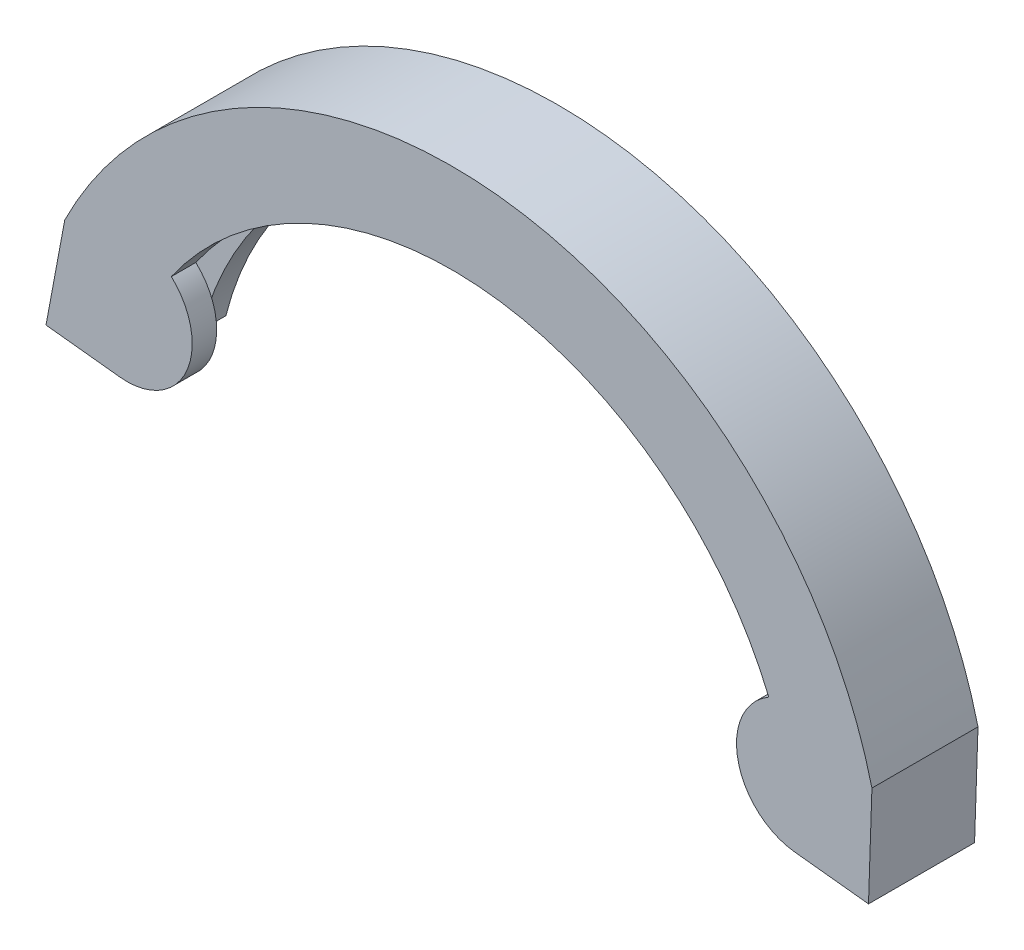
ISO-10303-21;
HEADER;
FILE_DESCRIPTION(('STEP AP214'),'2;1');
FILE_NAME('part.step','',(''),(''),'','','');
FILE_SCHEMA(('AUTOMOTIVE_DESIGN { 1 0 10303 214 1 1 1 1 }'));
ENDSEC;
DATA;
#1=APPLICATION_CONTEXT('core data for automotive mechanical design processes');
#2=APPLICATION_PROTOCOL_DEFINITION('international standard','automotive_design',2000,#1);
#3=PRODUCT_CONTEXT('',#1,'mechanical');
#4=PRODUCT('Part','Part','',(#3));
#5=PRODUCT_RELATED_PRODUCT_CATEGORY('part','',(#4));
#6=PRODUCT_DEFINITION_FORMATION('','',#4);
#7=PRODUCT_DEFINITION_CONTEXT('part definition',#1,'design');
#8=PRODUCT_DEFINITION('design','',#6,#7);
#9=PRODUCT_DEFINITION_SHAPE('','',#8);
#10=(LENGTH_UNIT() NAMED_UNIT(*) SI_UNIT(.MILLI.,.METRE.));
#11=(NAMED_UNIT(*) PLANE_ANGLE_UNIT() SI_UNIT($,.RADIAN.));
#12=(NAMED_UNIT(*) SI_UNIT($,.STERADIAN.) SOLID_ANGLE_UNIT());
#13=UNCERTAINTY_MEASURE_WITH_UNIT(LENGTH_MEASURE(1.E-05),#10,'distance_accuracy_value','');
#14=(GEOMETRIC_REPRESENTATION_CONTEXT(3) GLOBAL_UNCERTAINTY_ASSIGNED_CONTEXT((#13)) GLOBAL_UNIT_ASSIGNED_CONTEXT((#10,
#11,#12)) REPRESENTATION_CONTEXT('',''));
#15=CARTESIAN_POINT('',(0.,0.,0.));
#16=DIRECTION('',(0.,0.,1.));
#17=DIRECTION('',(1.,0.,0.));
#18=AXIS2_PLACEMENT_3D('',#15,#16,#17);
#19=CARTESIAN_POINT('',(0.,0.,-10.));
#20=DIRECTION('',(0.,0.,1.));
#21=DIRECTION('',(1.,0.,0.));
#22=AXIS2_PLACEMENT_3D('',#19,#20,#21);
#23=PLANE('',#22);
#24=DIRECTION('',(0.99405633822232,-0.108866874851961,0.));
#25=VECTOR('',#24,1.);
#26=CARTESIAN_POINT('',(53.,0.,-10.));
#27=LINE('',#26,#25);
#28=CARTESIAN_POINT('',(-49.773300704899,11.2555069926639,-10.));
#29=VERTEX_POINT('',#28);
#30=CARTESIAN_POINT('',(-40.7263530118166,10.2647050789048,-10.));
#31=VERTEX_POINT('',#30);
#32=EDGE_CURVE('E154',#29,#31,#27,.T.);
#33=ORIENTED_EDGE('',*,*,#32,.F.);
#34=DIRECTION('',(0.183719720173245,0.982978669361378,0.));
#35=VECTOR('',#34,1.);
#36=CARTESIAN_POINT('',(-50.125966582815,9.36859449858783,-10.));
#37=LINE('',#36,#35);
#38=CARTESIAN_POINT('',(-47.4723966917525,23.5663224186738,-10.));
#39=VERTEX_POINT('',#38);
#40=EDGE_CURVE('E130',#29,#39,#37,.T.);
#41=ORIENTED_EDGE('',*,*,#40,.T.);
#42=CARTESIAN_POINT('',(0.,0.,-10.));
#43=DIRECTION('',(0.,0.,1.));
#44=DIRECTION('',(1.,0.,0.));
#45=AXIS2_PLACEMENT_3D('',#42,#43,#44);
#46=CIRCLE('',#45,53.);
#47=CARTESIAN_POINT('',(51.450152385228,12.7232786472992,-10.));
#48=VERTEX_POINT('',#47);
#49=EDGE_CURVE('E182',#39,#48,#46,.F.);
#50=ORIENTED_EDGE('',*,*,#49,.T.);
#51=DIRECTION('',(-0.0336040786394591,-0.999435223463128,0.));
#52=VECTOR('',#51,1.);
#53=CARTESIAN_POINT('',(50.9647405349259,-1.71359094473466,-10.));
#54=LINE('',#53,#52);
#55=CARTESIAN_POINT('',(51.0296123275424,0.215792546055185,-10.));
#56=VERTEX_POINT('',#55);
#57=EDGE_CURVE('E240',#48,#56,#54,.T.);
#58=ORIENTED_EDGE('',*,*,#57,.T.);
#59=CARTESIAN_POINT('',(41.9826646344601,1.20659445981428,-10.));
#60=VERTEX_POINT('',#59);
#61=EDGE_CURVE('E162',#60,#56,#27,.T.);
#62=ORIENTED_EDGE('',*,*,#61,.F.);
#63=CARTESIAN_POINT('',(0.,0.,-10.));
#64=DIRECTION('',(0.,0.,-1.));
#65=DIRECTION('',(-1.,0.,0.));
#66=AXIS2_PLACEMENT_3D('',#63,#64,#65);
#67=CIRCLE('',#66,42.);
#68=EDGE_CURVE('E213',#60,#31,#67,.F.);
#69=ORIENTED_EDGE('',*,*,#68,.T.);
#70=EDGE_LOOP('',(#33,#41,#50,#58,#62,#69));
#71=FACE_BOUND('',#70,.T.);
#72=ADVANCED_FACE('F39',(#71),#23,.F.);
#73=CARTESIAN_POINT('',(0.,0.,3.));
#74=DIRECTION('',(0.,0.,-1.));
#75=DIRECTION('',(-1.,0.,0.));
#76=AXIS2_PLACEMENT_3D('',#73,#74,#75);
#77=PLANE('',#76);
#78=CARTESIAN_POINT('',(0.,0.,3.));
#79=DIRECTION('',(0.,0.,-1.));
#80=DIRECTION('',(-1.,0.,0.));
#81=AXIS2_PLACEMENT_3D('',#78,#79,#80);
#82=CIRCLE('',#81,53.);
#83=CARTESIAN_POINT('',(-47.4723966917525,23.5663224186738,3.));
#84=VERTEX_POINT('',#83);
#85=CARTESIAN_POINT('',(51.450152385228,12.7232786472992,3.));
#86=VERTEX_POINT('',#85);
#87=EDGE_CURVE('E146',#84,#86,#82,.T.);
#88=ORIENTED_EDGE('',*,*,#87,.F.);
#89=DIRECTION('',(-0.183719720173245,-0.982978669361378,0.));
#90=VECTOR('',#89,1.);
#91=CARTESIAN_POINT('',(-50.125966582815,9.36859449858783,3.));
#92=LINE('',#91,#90);
#93=CARTESIAN_POINT('',(-49.773300704899,11.2555069926639,3.));
#94=VERTEX_POINT('',#93);
#95=EDGE_CURVE('E127',#84,#94,#92,.T.);
#96=ORIENTED_EDGE('',*,*,#95,.T.);
#97=DIRECTION('',(-0.99405633822232,0.108866874851961,0.));
#98=VECTOR('',#97,1.);
#99=CARTESIAN_POINT('',(-51.7436883773565,11.4712995387191,3.));
#100=LINE('',#99,#98);
#101=CARTESIAN_POINT('',(-40.7263530118166,10.2647050789048,3.));
#102=VERTEX_POINT('',#101);
#103=EDGE_CURVE('E142',#102,#94,#100,.T.);
#104=ORIENTED_EDGE('',*,*,#103,.F.);
#105=CARTESIAN_POINT('',(-39.8554180130009,18.2171557846834,3.));
#106=DIRECTION('',(0.,0.,1.));
#107=DIRECTION('',(1.,0.,0.));
#108=AXIS2_PLACEMENT_3D('',#105,#106,#107);
#109=CIRCLE('',#108,8.);
#110=CARTESIAN_POINT('',(-34.4118522596681,24.0795436846045,3.));
#111=VERTEX_POINT('',#110);
#112=EDGE_CURVE('E229',#102,#111,#109,.T.);
#113=ORIENTED_EDGE('',*,*,#112,.T.);
#114=CARTESIAN_POINT('',(0.,0.,3.));
#115=DIRECTION('',(0.,0.,-1.));
#116=DIRECTION('',(-1.,0.,0.));
#117=AXIS2_PLACEMENT_3D('',#114,#115,#116);
#118=CIRCLE('',#117,42.);
#119=CARTESIAN_POINT('',(38.8079210976164,16.0606743345721,3.));
#120=VERTEX_POINT('',#119);
#121=EDGE_CURVE('E58',#120,#111,#118,.F.);
#122=ORIENTED_EDGE('',*,*,#121,.F.);
#123=CARTESIAN_POINT('',(42.8535996332758,9.15904516559284,3.));
#124=DIRECTION('',(0.,0.,1.));
#125=DIRECTION('',(1.,0.,0.));
#126=AXIS2_PLACEMENT_3D('',#123,#124,#125);
#127=CIRCLE('',#126,8.);
#128=CARTESIAN_POINT('',(41.9826646344601,1.20659445981428,3.));
#129=VERTEX_POINT('',#128);
#130=EDGE_CURVE('E224',#120,#129,#127,.T.);
#131=ORIENTED_EDGE('',*,*,#130,.T.);
#132=CARTESIAN_POINT('',(51.0296123275424,0.215792546055185,3.));
#133=VERTEX_POINT('',#132);
#134=EDGE_CURVE('E157',#133,#129,#100,.T.);
#135=ORIENTED_EDGE('',*,*,#134,.F.);
#136=DIRECTION('',(0.0336040786394591,0.999435223463128,0.));
#137=VECTOR('',#136,1.);
#138=CARTESIAN_POINT('',(50.9647405349259,-1.71359094473466,3.));
#139=LINE('',#138,#137);
#140=EDGE_CURVE('E244',#133,#86,#139,.T.);
#141=ORIENTED_EDGE('',*,*,#140,.T.);
#142=EDGE_LOOP('',(#88,#96,#104,#113,#122,#131,#135,#141));
#143=FACE_BOUND('',#142,.T.);
#144=ADVANCED_FACE('F41',(#143),#77,.F.);
#145=CARTESIAN_POINT('',(-51.7436883773565,11.4712995387191,154.383627261102));
#146=DIRECTION('',(0.108866874851961,0.99405633822232,0.));
#147=DIRECTION('',(-0.99405633822232,0.108866874851961,0.));
#148=AXIS2_PLACEMENT_3D('',#145,#146,#147);
#149=PLANE('',#148);
#150=DIRECTION('',(0.,0.,-1.));
#151=VECTOR('',#150,1.);
#152=CARTESIAN_POINT('',(41.9826646344601,1.20659445981428,10.));
#153=LINE('',#152,#151);
#154=CARTESIAN_POINT('',(41.9826646344601,1.20659445981428,-7.));
#155=VERTEX_POINT('',#154);
#156=EDGE_CURVE('E177',#155,#60,#153,.T.);
#157=ORIENTED_EDGE('',*,*,#156,.T.);
#158=ORIENTED_EDGE('',*,*,#61,.T.);
#159=DIRECTION('',(0.,0.,-1.));
#160=VECTOR('',#159,1.);
#161=CARTESIAN_POINT('',(51.0296123275424,0.215792546055185,3.));
#162=LINE('',#161,#160);
#163=EDGE_CURVE('E137',#133,#56,#162,.T.);
#164=ORIENTED_EDGE('',*,*,#163,.F.);
#165=ORIENTED_EDGE('',*,*,#134,.T.);
#166=CARTESIAN_POINT('',(41.9826646344601,1.20659445981428,0.));
#167=VERTEX_POINT('',#166);
#168=EDGE_CURVE('E168',#129,#167,#153,.T.);
#169=ORIENTED_EDGE('',*,*,#168,.T.);
#170=DIRECTION('',(0.99405633822232,-0.108866874851961,0.));
#171=VECTOR('',#170,1.);
#172=CARTESIAN_POINT('',(0.62815581132173,5.73564976935956,0.));
#173=LINE('',#172,#171);
#174=CARTESIAN_POINT('',(49.9989197371834,0.328671743069433,0.));
#175=VERTEX_POINT('',#174);
#176=EDGE_CURVE('E175',#167,#175,#173,.T.);
#177=ORIENTED_EDGE('',*,*,#176,.T.);
#178=DIRECTION('',(0.,0.,-1.));
#179=VECTOR('',#178,1.);
#180=CARTESIAN_POINT('',(49.9989197371834,0.328671743069432,0.));
#181=LINE('',#180,#179);
#182=CARTESIAN_POINT('',(49.9989197371834,0.328671743069432,-7.));
#183=VERTEX_POINT('',#182);
#184=EDGE_CURVE('E164',#175,#183,#181,.T.);
#185=ORIENTED_EDGE('',*,*,#184,.T.);
#186=DIRECTION('',(-0.99405633822232,0.108866874851961,0.));
#187=VECTOR('',#186,1.);
#188=CARTESIAN_POINT('',(0.628155811321729,5.73564976935956,-7.));
#189=LINE('',#188,#187);
#190=EDGE_CURVE('E155',#183,#155,#189,.T.);
#191=ORIENTED_EDGE('',*,*,#190,.T.);
#192=EDGE_LOOP('',(#157,#158,#164,#165,#169,#177,#185,#191));
#193=FACE_BOUND('',#192,.T.);
#194=ADVANCED_FACE('F256',(#193),#149,.F.);
#195=DIRECTION('',(0.,0.,-1.));
#196=VECTOR('',#195,1.);
#197=CARTESIAN_POINT('',(-40.7263530118166,10.2647050789048,10.));
#198=LINE('',#197,#196);
#199=CARTESIAN_POINT('',(-40.7263530118166,10.2647050789048,0.));
#200=VERTEX_POINT('',#199);
#201=EDGE_CURVE('E151',#102,#200,#198,.T.);
#202=ORIENTED_EDGE('',*,*,#201,.F.);
#203=ORIENTED_EDGE('',*,*,#103,.T.);
#204=DIRECTION('',(0.,0.,1.));
#205=VECTOR('',#204,1.);
#206=CARTESIAN_POINT('',(-49.773300704899,11.2555069926639,-10.));
#207=LINE('',#206,#205);
#208=EDGE_CURVE('E124',#29,#94,#207,.T.);
#209=ORIENTED_EDGE('',*,*,#208,.F.);
#210=ORIENTED_EDGE('',*,*,#32,.T.);
#211=CARTESIAN_POINT('',(-40.7263530118166,10.2647050789048,-7.));
#212=VERTEX_POINT('',#211);
#213=EDGE_CURVE('E185',#212,#31,#198,.T.);
#214=ORIENTED_EDGE('',*,*,#213,.F.);
#215=CARTESIAN_POINT('',(-48.7426081145399,11.1426277956497,-7.));
#216=VERTEX_POINT('',#215);
#217=EDGE_CURVE('E160',#212,#216,#189,.T.);
#218=ORIENTED_EDGE('',*,*,#217,.T.);
#219=DIRECTION('',(0.,0.,-1.));
#220=VECTOR('',#219,1.);
#221=CARTESIAN_POINT('',(-48.7426081145399,11.1426277956497,0.));
#222=LINE('',#221,#220);
#223=CARTESIAN_POINT('',(-48.7426081145399,11.1426277956497,0.));
#224=VERTEX_POINT('',#223);
#225=EDGE_CURVE('E196',#216,#224,#222,.F.);
#226=ORIENTED_EDGE('',*,*,#225,.T.);
#227=EDGE_CURVE('E192',#224,#200,#173,.T.);
#228=ORIENTED_EDGE('',*,*,#227,.T.);
#229=EDGE_LOOP('',(#202,#203,#209,#210,#214,#218,#226,#228));
#230=FACE_BOUND('',#229,.T.);
#231=ADVANCED_FACE('F149',(#230),#149,.F.);
#232=CARTESIAN_POINT('',(0.,0.,-7.));
#233=DIRECTION('',(0.,0.,1.));
#234=DIRECTION('',(1.,0.,0.));
#235=AXIS2_PLACEMENT_3D('',#232,#233,#234);
#236=PLANE('',#235);
#237=ORIENTED_EDGE('',*,*,#217,.F.);
#238=CARTESIAN_POINT('',(0.,0.,-7.));
#239=DIRECTION('',(0.,0.,1.));
#240=DIRECTION('',(1.,0.,0.));
#241=AXIS2_PLACEMENT_3D('',#238,#239,#240);
#242=CIRCLE('',#241,42.);
#243=EDGE_CURVE('E187',#212,#155,#242,.F.);
#244=ORIENTED_EDGE('',*,*,#243,.T.);
#245=ORIENTED_EDGE('',*,*,#190,.F.);
#246=CARTESIAN_POINT('',(0.,0.,-7.));
#247=DIRECTION('',(0.,0.,-1.));
#248=DIRECTION('',(-1.,0.,0.));
#249=AXIS2_PLACEMENT_3D('',#246,#247,#248);
#250=CIRCLE('',#249,50.);
#251=EDGE_CURVE('E195',#216,#183,#250,.T.);
#252=ORIENTED_EDGE('',*,*,#251,.F.);
#253=EDGE_LOOP('',(#237,#244,#245,#252));
#254=FACE_BOUND('',#253,.T.);
#255=ADVANCED_FACE('F265',(#254),#236,.T.);
#256=CARTESIAN_POINT('',(0.,0.,0.));
#257=DIRECTION('',(0.,0.,-1.));
#258=DIRECTION('',(-1.,0.,0.));
#259=AXIS2_PLACEMENT_3D('',#256,#257,#258);
#260=PLANE('',#259);
#261=CARTESIAN_POINT('',(0.,0.,0.));
#262=DIRECTION('',(0.,0.,-1.));
#263=DIRECTION('',(-1.,0.,0.));
#264=AXIS2_PLACEMENT_3D('',#261,#262,#263);
#265=CIRCLE('',#264,50.);
#266=EDGE_CURVE('E203',#224,#175,#265,.T.);
#267=ORIENTED_EDGE('',*,*,#266,.T.);
#268=ORIENTED_EDGE('',*,*,#176,.F.);
#269=CARTESIAN_POINT('',(42.8535996332758,9.15904516559284,0.));
#270=DIRECTION('',(0.,0.,1.));
#271=DIRECTION('',(1.,0.,0.));
#272=AXIS2_PLACEMENT_3D('',#269,#270,#271);
#273=CIRCLE('',#272,8.);
#274=CARTESIAN_POINT('',(38.8079210976164,16.0606743345721,0.));
#275=VERTEX_POINT('',#274);
#276=EDGE_CURVE('E228',#275,#167,#273,.T.);
#277=ORIENTED_EDGE('',*,*,#276,.F.);
#278=CARTESIAN_POINT('',(0.,0.,0.));
#279=DIRECTION('',(0.,0.,-1.));
#280=DIRECTION('',(-1.,0.,0.));
#281=AXIS2_PLACEMENT_3D('',#278,#279,#280);
#282=CIRCLE('',#281,42.);
#283=CARTESIAN_POINT('',(-34.4118522596681,24.0795436846045,0.));
#284=VERTEX_POINT('',#283);
#285=EDGE_CURVE('E191',#275,#284,#282,.F.);
#286=ORIENTED_EDGE('',*,*,#285,.T.);
#287=CARTESIAN_POINT('',(-39.8554180130009,18.2171557846834,0.));
#288=DIRECTION('',(0.,0.,1.));
#289=DIRECTION('',(1.,0.,0.));
#290=AXIS2_PLACEMENT_3D('',#287,#288,#289);
#291=CIRCLE('',#290,8.);
#292=EDGE_CURVE('E136',#200,#284,#291,.T.);
#293=ORIENTED_EDGE('',*,*,#292,.F.);
#294=ORIENTED_EDGE('',*,*,#227,.F.);
#295=EDGE_LOOP('',(#267,#268,#277,#286,#293,#294));
#296=FACE_BOUND('',#295,.T.);
#297=ADVANCED_FACE('F276',(#296),#260,.T.);
#298=CARTESIAN_POINT('',(0.,0.,0.));
#299=DIRECTION('',(0.,0.,-1.));
#300=DIRECTION('',(-1.,0.,0.));
#301=AXIS2_PLACEMENT_3D('',#298,#299,#300);
#302=CYLINDRICAL_SURFACE('',#301,53.);
#303=ORIENTED_EDGE('',*,*,#87,.T.);
#304=DIRECTION('',(0.,0.,-1.));
#305=VECTOR('',#304,1.);
#306=CARTESIAN_POINT('',(51.450152385228,12.7232786472992,0.));
#307=LINE('',#306,#305);
#308=EDGE_CURVE('E216',#86,#48,#307,.T.);
#309=ORIENTED_EDGE('',*,*,#308,.T.);
#310=ORIENTED_EDGE('',*,*,#49,.F.);
#311=DIRECTION('',(0.,0.,-1.));
#312=VECTOR('',#311,1.);
#313=CARTESIAN_POINT('',(-47.4723966917525,23.5663224186738,0.));
#314=LINE('',#313,#312);
#315=EDGE_CURVE('E209',#39,#84,#314,.F.);
#316=ORIENTED_EDGE('',*,*,#315,.T.);
#317=EDGE_LOOP('',(#303,#309,#310,#316));
#318=FACE_BOUND('',#317,.T.);
#319=ADVANCED_FACE('F252',(#318),#302,.T.);
#320=CARTESIAN_POINT('',(0.,0.,0.));
#321=DIRECTION('',(0.,0.,-1.));
#322=DIRECTION('',(-1.,0.,0.));
#323=AXIS2_PLACEMENT_3D('',#320,#321,#322);
#324=CYLINDRICAL_SURFACE('',#323,50.);
#325=ORIENTED_EDGE('',*,*,#184,.F.);
#326=ORIENTED_EDGE('',*,*,#266,.F.);
#327=ORIENTED_EDGE('',*,*,#225,.F.);
#328=ORIENTED_EDGE('',*,*,#251,.T.);
#329=EDGE_LOOP('',(#325,#326,#327,#328));
#330=FACE_BOUND('',#329,.T.);
#331=ADVANCED_FACE('F283',(#330),#324,.F.);
#332=CARTESIAN_POINT('',(0.,0.,10.));
#333=DIRECTION('',(0.,0.,-1.));
#334=DIRECTION('',(-1.,0.,0.));
#335=AXIS2_PLACEMENT_3D('',#332,#333,#334);
#336=CYLINDRICAL_SURFACE('',#335,42.);
#337=DIRECTION('',(0.,0.,1.));
#338=VECTOR('',#337,1.);
#339=CARTESIAN_POINT('',(-34.4118522596681,24.0795436846045,1.5));
#340=LINE('',#339,#338);
#341=EDGE_CURVE('E11',#284,#111,#340,.T.);
#342=ORIENTED_EDGE('',*,*,#341,.F.);
#343=ORIENTED_EDGE('',*,*,#285,.F.);
#344=DIRECTION('',(0.,0.,1.));
#345=VECTOR('',#344,1.);
#346=CARTESIAN_POINT('',(38.8079210976164,16.0606743345721,1.5));
#347=LINE('',#346,#345);
#348=EDGE_CURVE('E48',#120,#275,#347,.F.);
#349=ORIENTED_EDGE('',*,*,#348,.F.);
#350=ORIENTED_EDGE('',*,*,#121,.T.);
#351=EDGE_LOOP('',(#342,#343,#349,#350));
#352=FACE_BOUND('',#351,.T.);
#353=ADVANCED_FACE('F400',(#352),#336,.F.);
#354=ORIENTED_EDGE('',*,*,#68,.F.);
#355=ORIENTED_EDGE('',*,*,#156,.F.);
#356=ORIENTED_EDGE('',*,*,#243,.F.);
#357=ORIENTED_EDGE('',*,*,#213,.T.);
#358=EDGE_LOOP('',(#354,#355,#356,#357));
#359=FACE_BOUND('',#358,.T.);
#360=ADVANCED_FACE('F294',(#359),#336,.F.);
#361=CARTESIAN_POINT('',(42.8535996332758,9.15904516559284,0.));
#362=DIRECTION('',(0.,0.,1.));
#363=DIRECTION('',(1.,0.,0.));
#364=AXIS2_PLACEMENT_3D('',#361,#362,#363);
#365=CYLINDRICAL_SURFACE('',#364,8.);
#366=ORIENTED_EDGE('',*,*,#276,.T.);
#367=ORIENTED_EDGE('',*,*,#168,.F.);
#368=ORIENTED_EDGE('',*,*,#130,.F.);
#369=ORIENTED_EDGE('',*,*,#348,.T.);
#370=EDGE_LOOP('',(#366,#367,#368,#369));
#371=FACE_BOUND('',#370,.T.);
#372=ADVANCED_FACE('F273',(#371),#365,.T.);
#373=CARTESIAN_POINT('',(-39.8554180130009,18.2171557846834,0.));
#374=DIRECTION('',(0.,0.,1.));
#375=DIRECTION('',(1.,0.,0.));
#376=AXIS2_PLACEMENT_3D('',#373,#374,#375);
#377=CYLINDRICAL_SURFACE('',#376,8.);
#378=ORIENTED_EDGE('',*,*,#292,.T.);
#379=ORIENTED_EDGE('',*,*,#341,.T.);
#380=ORIENTED_EDGE('',*,*,#112,.F.);
#381=ORIENTED_EDGE('',*,*,#201,.T.);
#382=EDGE_LOOP('',(#378,#379,#380,#381));
#383=FACE_BOUND('',#382,.T.);
#384=ADVANCED_FACE('F285',(#383),#377,.T.);
#385=CARTESIAN_POINT('',(51.450152385228,12.7232786472992,-10.000012));
#386=DIRECTION('',(-0.999435223463128,0.0336040786394591,0.));
#387=DIRECTION('',(-0.0336040786394591,-0.999435223463128,0.));
#388=AXIS2_PLACEMENT_3D('',#385,#386,#387);
#389=PLANE('',#388);
#390=ORIENTED_EDGE('',*,*,#308,.F.);
#391=ORIENTED_EDGE('',*,*,#140,.F.);
#392=ORIENTED_EDGE('',*,*,#163,.T.);
#393=ORIENTED_EDGE('',*,*,#57,.F.);
#394=EDGE_LOOP('',(#390,#391,#392,#393));
#395=FACE_BOUND('',#394,.T.);
#396=ADVANCED_FACE('F254',(#395),#389,.F.);
#397=CARTESIAN_POINT('',(-47.4723966917525,23.5663224186738,3.000012));
#398=DIRECTION('',(0.982978669361378,-0.183719720173245,0.));
#399=DIRECTION('',(0.183719720173245,0.982978669361378,0.));
#400=AXIS2_PLACEMENT_3D('',#397,#398,#399);
#401=PLANE('',#400);
#402=ORIENTED_EDGE('',*,*,#208,.T.);
#403=ORIENTED_EDGE('',*,*,#95,.F.);
#404=ORIENTED_EDGE('',*,*,#315,.F.);
#405=ORIENTED_EDGE('',*,*,#40,.F.);
#406=EDGE_LOOP('',(#402,#403,#404,#405));
#407=FACE_BOUND('',#406,.T.);
#408=ADVANCED_FACE('F126',(#407),#401,.F.);
#409=CLOSED_SHELL('',(#72,#144,#194,#231,#255,#297,#319,#331,#353,#360,#372,#384,#396,#408));
#410=MANIFOLD_SOLID_BREP('B2',#409);
#411=ADVANCED_BREP_SHAPE_REPRESENTATION('',(#18,#410),#14);
#412=SHAPE_DEFINITION_REPRESENTATION(#9,#411);
ENDSEC;
END-ISO-10303-21;
